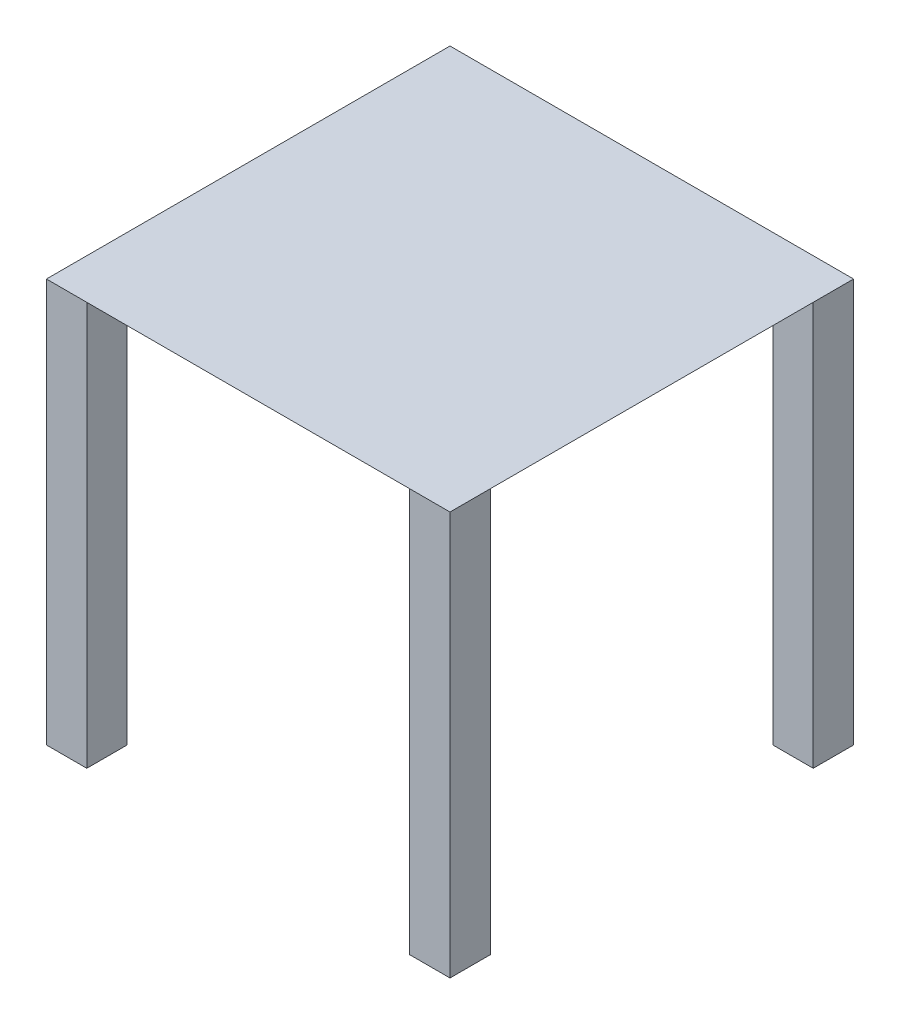
ISO-10303-21;
HEADER;
FILE_DESCRIPTION(('STEP AP214'),'2;1');
FILE_NAME('part.step','',(''),(''),'','','');
FILE_SCHEMA(('AUTOMOTIVE_DESIGN { 1 0 10303 214 1 1 1 1 }'));
ENDSEC;
DATA;
#1=APPLICATION_CONTEXT('core data for automotive mechanical design processes');
#2=APPLICATION_PROTOCOL_DEFINITION('international standard','automotive_design',2000,#1);
#3=PRODUCT_CONTEXT('',#1,'mechanical');
#4=PRODUCT('Part','Part','',(#3));
#5=PRODUCT_RELATED_PRODUCT_CATEGORY('part','',(#4));
#6=PRODUCT_DEFINITION_FORMATION('','',#4);
#7=PRODUCT_DEFINITION_CONTEXT('part definition',#1,'design');
#8=PRODUCT_DEFINITION('design','',#6,#7);
#9=PRODUCT_DEFINITION_SHAPE('','',#8);
#10=(LENGTH_UNIT() NAMED_UNIT(*) SI_UNIT(.MILLI.,.METRE.));
#11=(NAMED_UNIT(*) PLANE_ANGLE_UNIT() SI_UNIT($,.RADIAN.));
#12=(NAMED_UNIT(*) SI_UNIT($,.STERADIAN.) SOLID_ANGLE_UNIT());
#13=UNCERTAINTY_MEASURE_WITH_UNIT(LENGTH_MEASURE(1.E-05),#10,'distance_accuracy_value','');
#14=(GEOMETRIC_REPRESENTATION_CONTEXT(3) GLOBAL_UNCERTAINTY_ASSIGNED_CONTEXT((#13)) GLOBAL_UNIT_ASSIGNED_CONTEXT((#10,
#11,#12)) REPRESENTATION_CONTEXT('',''));
#15=CARTESIAN_POINT('',(0.,0.,0.));
#16=DIRECTION('',(0.,0.,1.));
#17=DIRECTION('',(1.,0.,0.));
#18=AXIS2_PLACEMENT_3D('',#15,#16,#17);
#19=CARTESIAN_POINT('',(0.,0.,0.));
#20=DIRECTION('',(0.,-1.,0.));
#21=DIRECTION('',(0.,0.,-1.));
#22=AXIS2_PLACEMENT_3D('',#19,#20,#21);
#23=PLANE('',#22);
#24=DIRECTION('',(1.,0.,0.));
#25=VECTOR('',#24,1.);
#26=CARTESIAN_POINT('',(-500.,0.,500.));
#27=LINE('',#26,#25);
#28=CARTESIAN_POINT('',(-400.,0.,500.));
#29=VERTEX_POINT('',#28);
#30=CARTESIAN_POINT('',(400.,0.,500.));
#31=VERTEX_POINT('',#30);
#32=EDGE_CURVE('E47',#29,#31,#27,.T.);
#33=ORIENTED_EDGE('',*,*,#32,.T.);
#34=DIRECTION('',(1.,0.,0.));
#35=VECTOR('',#34,1.);
#36=CARTESIAN_POINT('',(500.,0.,500.));
#37=LINE('',#36,#35);
#38=CARTESIAN_POINT('',(500.,0.,500.));
#39=VERTEX_POINT('',#38);
#40=EDGE_CURVE('E204',#31,#39,#37,.T.);
#41=ORIENTED_EDGE('',*,*,#40,.T.);
#42=DIRECTION('',(0.,0.,-1.));
#43=VECTOR('',#42,1.);
#44=CARTESIAN_POINT('',(500.,0.,500.));
#45=LINE('',#44,#43);
#46=CARTESIAN_POINT('',(500.,0.,400.));
#47=VERTEX_POINT('',#46);
#48=EDGE_CURVE('E228',#39,#47,#45,.T.);
#49=ORIENTED_EDGE('',*,*,#48,.T.);
#50=CARTESIAN_POINT('',(500.,0.,-400.));
#51=VERTEX_POINT('',#50);
#52=EDGE_CURVE('E233',#47,#51,#45,.T.);
#53=ORIENTED_EDGE('',*,*,#52,.T.);
#54=DIRECTION('',(0.,0.,-1.));
#55=VECTOR('',#54,1.);
#56=CARTESIAN_POINT('',(500.,0.,-500.));
#57=LINE('',#56,#55);
#58=CARTESIAN_POINT('',(500.,0.,-500.));
#59=VERTEX_POINT('',#58);
#60=EDGE_CURVE('E352',#51,#59,#57,.T.);
#61=ORIENTED_EDGE('',*,*,#60,.T.);
#62=DIRECTION('',(-1.,0.,0.));
#63=VECTOR('',#62,1.);
#64=CARTESIAN_POINT('',(-500.,0.,-500.));
#65=LINE('',#64,#63);
#66=CARTESIAN_POINT('',(400.,0.,-500.));
#67=VERTEX_POINT('',#66);
#68=EDGE_CURVE('E468',#59,#67,#65,.T.);
#69=ORIENTED_EDGE('',*,*,#68,.T.);
#70=CARTESIAN_POINT('',(-400.,0.,-500.));
#71=VERTEX_POINT('',#70);
#72=EDGE_CURVE('E232',#67,#71,#65,.T.);
#73=ORIENTED_EDGE('',*,*,#72,.T.);
#74=DIRECTION('',(-1.,0.,0.));
#75=VECTOR('',#74,1.);
#76=CARTESIAN_POINT('',(-500.,0.,-500.));
#77=LINE('',#76,#75);
#78=CARTESIAN_POINT('',(-500.,0.,-500.));
#79=VERTEX_POINT('',#78);
#80=EDGE_CURVE('E380',#71,#79,#77,.T.);
#81=ORIENTED_EDGE('',*,*,#80,.T.);
#82=DIRECTION('',(0.,0.,1.));
#83=VECTOR('',#82,1.);
#84=CARTESIAN_POINT('',(-500.,0.,500.));
#85=LINE('',#84,#83);
#86=CARTESIAN_POINT('',(-500.,0.,-400.));
#87=VERTEX_POINT('',#86);
#88=EDGE_CURVE('E457',#79,#87,#85,.T.);
#89=ORIENTED_EDGE('',*,*,#88,.T.);
#90=CARTESIAN_POINT('',(-500.,0.,400.));
#91=VERTEX_POINT('',#90);
#92=EDGE_CURVE('E460',#87,#91,#85,.T.);
#93=ORIENTED_EDGE('',*,*,#92,.T.);
#94=DIRECTION('',(0.,0.,1.));
#95=VECTOR('',#94,1.);
#96=CARTESIAN_POINT('',(-500.,0.,500.));
#97=LINE('',#96,#95);
#98=CARTESIAN_POINT('',(-500.,0.,500.));
#99=VERTEX_POINT('',#98);
#100=EDGE_CURVE('E222',#91,#99,#97,.T.);
#101=ORIENTED_EDGE('',*,*,#100,.T.);
#102=EDGE_CURVE('E473',#99,#29,#27,.T.);
#103=ORIENTED_EDGE('',*,*,#102,.T.);
#104=EDGE_LOOP('',(#33,#41,#49,#53,#61,#69,#73,#81,#89,#93,#101,#103));
#105=FACE_BOUND('',#104,.T.);
#106=ADVANCED_FACE('F42',(#105),#23,.F.);
#107=CARTESIAN_POINT('',(-195.121951219512,-243.90243902439,0.));
#108=DIRECTION('',(0.624695047554424,0.78086880944303,0.));
#109=DIRECTION('',(-0.78086880944303,0.624695047554424,0.));
#110=AXIS2_PLACEMENT_3D('',#107,#108,#109);
#111=PLANE('',#110);
#112=DIRECTION('',(0.615457454896664,-0.492365963917331,-0.615457454896664));
#113=VECTOR('',#112,1.);
#114=CARTESIAN_POINT('',(-500.,0.,500.));
#115=LINE('',#114,#113);
#116=CARTESIAN_POINT('',(-400.,-80.,400.));
#117=VERTEX_POINT('',#116);
#118=CARTESIAN_POINT('',(-75.0000000000011,-339.999999999999,75.0000000000015));
#119=VERTEX_POINT('',#118);
#120=EDGE_CURVE('E456',#117,#119,#115,.T.);
#121=ORIENTED_EDGE('',*,*,#120,.F.);
#122=DIRECTION('',(-0.78086880944303,0.624695047554424,0.));
#123=VECTOR('',#122,1.);
#124=CARTESIAN_POINT('',(-195.121951219512,-243.90243902439,400.));
#125=LINE('',#124,#123);
#126=EDGE_CURVE('E348',#117,#91,#125,.T.);
#127=ORIENTED_EDGE('',*,*,#126,.T.);
#128=ORIENTED_EDGE('',*,*,#92,.F.);
#129=DIRECTION('',(0.78086880944303,-0.624695047554424,0.));
#130=VECTOR('',#129,1.);
#131=CARTESIAN_POINT('',(-195.121951219512,-243.90243902439,-400.));
#132=LINE('',#131,#130);
#133=CARTESIAN_POINT('',(-400.,-80.,-400.));
#134=VERTEX_POINT('',#133);
#135=EDGE_CURVE('E398',#87,#134,#132,.T.);
#136=ORIENTED_EDGE('',*,*,#135,.T.);
#137=DIRECTION('',(0.615457454896664,-0.492365963917331,0.615457454896664));
#138=VECTOR('',#137,1.);
#139=CARTESIAN_POINT('',(-500.,0.,-500.));
#140=LINE('',#139,#138);
#141=CARTESIAN_POINT('',(-75.0000000000011,-340.000000000001,-74.9999999999985));
#142=VERTEX_POINT('',#141);
#143=EDGE_CURVE('E474',#134,#142,#140,.T.);
#144=ORIENTED_EDGE('',*,*,#143,.T.);
#145=DIRECTION('',(0.,0.,1.));
#146=VECTOR('',#145,1.);
#147=CARTESIAN_POINT('',(-75.0000000000011,-339.999999999999,0.));
#148=LINE('',#147,#146);
#149=EDGE_CURVE('E318',#142,#119,#148,.T.);
#150=ORIENTED_EDGE('',*,*,#149,.T.);
#151=EDGE_LOOP('',(#121,#127,#128,#136,#144,#150));
#152=FACE_BOUND('',#151,.T.);
#153=ADVANCED_FACE('F257',(#152),#111,.F.);
#154=CARTESIAN_POINT('',(0.,-243.90243902439,195.121951219512));
#155=DIRECTION('',(0.,0.78086880944303,-0.624695047554424));
#156=DIRECTION('',(0.,0.624695047554424,0.78086880944303));
#157=AXIS2_PLACEMENT_3D('',#154,#155,#156);
#158=PLANE('',#157);
#159=DIRECTION('',(-0.615457454896663,-0.492365963917331,-0.615457454896664));
#160=VECTOR('',#159,1.);
#161=CARTESIAN_POINT('',(500.,0.,500.));
#162=LINE('',#161,#160);
#163=CARTESIAN_POINT('',(400.,-80.,400.));
#164=VERTEX_POINT('',#163);
#165=CARTESIAN_POINT('',(74.9999999999989,-340.000000000001,75.0000000000015));
#166=VERTEX_POINT('',#165);
#167=EDGE_CURVE('E455',#164,#166,#162,.T.);
#168=ORIENTED_EDGE('',*,*,#167,.F.);
#169=DIRECTION('',(0.,0.624695047554424,0.78086880944303));
#170=VECTOR('',#169,1.);
#171=CARTESIAN_POINT('',(400.,-243.90243902439,195.121951219512));
#172=LINE('',#171,#170);
#173=EDGE_CURVE('E218',#164,#31,#172,.T.);
#174=ORIENTED_EDGE('',*,*,#173,.T.);
#175=ORIENTED_EDGE('',*,*,#32,.F.);
#176=DIRECTION('',(0.,-0.624695047554424,-0.78086880944303));
#177=VECTOR('',#176,1.);
#178=CARTESIAN_POINT('',(-400.,-243.90243902439,195.121951219512));
#179=LINE('',#178,#177);
#180=EDGE_CURVE('E53',#29,#117,#179,.T.);
#181=ORIENTED_EDGE('',*,*,#180,.T.);
#182=ORIENTED_EDGE('',*,*,#120,.T.);
#183=DIRECTION('',(1.,0.,0.));
#184=VECTOR('',#183,1.);
#185=CARTESIAN_POINT('',(0.,-339.999999999999,75.0000000000015));
#186=LINE('',#185,#184);
#187=EDGE_CURVE('E421',#119,#166,#186,.T.);
#188=ORIENTED_EDGE('',*,*,#187,.T.);
#189=EDGE_LOOP('',(#168,#174,#175,#181,#182,#188));
#190=FACE_BOUND('',#189,.T.);
#191=ADVANCED_FACE('F309',(#190),#158,.F.);
#192=CARTESIAN_POINT('',(0.,-243.90243902439,-195.121951219512));
#193=DIRECTION('',(0.,0.78086880944303,0.624695047554424));
#194=DIRECTION('',(0.,-0.624695047554424,0.78086880944303));
#195=AXIS2_PLACEMENT_3D('',#192,#193,#194);
#196=PLANE('',#195);
#197=ORIENTED_EDGE('',*,*,#72,.F.);
#198=DIRECTION('',(0.,-0.624695047554424,0.78086880944303));
#199=VECTOR('',#198,1.);
#200=CARTESIAN_POINT('',(400.,-243.90243902439,-195.121951219512));
#201=LINE('',#200,#199);
#202=CARTESIAN_POINT('',(400.,-80.,-400.));
#203=VERTEX_POINT('',#202);
#204=EDGE_CURVE('E442',#67,#203,#201,.T.);
#205=ORIENTED_EDGE('',*,*,#204,.T.);
#206=DIRECTION('',(-0.615457454896664,-0.492365963917331,0.615457454896664));
#207=VECTOR('',#206,1.);
#208=CARTESIAN_POINT('',(500.,0.,-500.));
#209=LINE('',#208,#207);
#210=CARTESIAN_POINT('',(74.9999999999984,-340.000000000001,-74.9999999999985));
#211=VERTEX_POINT('',#210);
#212=EDGE_CURVE('E449',#203,#211,#209,.T.);
#213=ORIENTED_EDGE('',*,*,#212,.T.);
#214=DIRECTION('',(-1.,0.,0.));
#215=VECTOR('',#214,1.);
#216=CARTESIAN_POINT('',(0.,-340.000000000001,-74.9999999999985));
#217=LINE('',#216,#215);
#218=EDGE_CURVE('E411',#211,#142,#217,.T.);
#219=ORIENTED_EDGE('',*,*,#218,.T.);
#220=ORIENTED_EDGE('',*,*,#143,.F.);
#221=DIRECTION('',(0.,0.624695047554424,-0.78086880944303));
#222=VECTOR('',#221,1.);
#223=CARTESIAN_POINT('',(-400.,-243.90243902439,-195.121951219512));
#224=LINE('',#223,#222);
#225=EDGE_CURVE('E450',#134,#71,#224,.T.);
#226=ORIENTED_EDGE('',*,*,#225,.T.);
#227=EDGE_LOOP('',(#197,#205,#213,#219,#220,#226));
#228=FACE_BOUND('',#227,.T.);
#229=ADVANCED_FACE('F301',(#228),#196,.F.);
#230=CARTESIAN_POINT('',(195.121951219512,-243.90243902439,0.));
#231=DIRECTION('',(-0.624695047554424,0.78086880944303,0.));
#232=DIRECTION('',(-0.78086880944303,-0.624695047554424,0.));
#233=AXIS2_PLACEMENT_3D('',#230,#231,#232);
#234=PLANE('',#233);
#235=ORIENTED_EDGE('',*,*,#52,.F.);
#236=DIRECTION('',(-0.78086880944303,-0.624695047554424,0.));
#237=VECTOR('',#236,1.);
#238=CARTESIAN_POINT('',(195.121951219512,-243.90243902439,400.));
#239=LINE('',#238,#237);
#240=EDGE_CURVE('E12',#47,#164,#239,.T.);
#241=ORIENTED_EDGE('',*,*,#240,.T.);
#242=ORIENTED_EDGE('',*,*,#167,.T.);
#243=DIRECTION('',(0.,0.,-1.));
#244=VECTOR('',#243,1.);
#245=CARTESIAN_POINT('',(74.9999999999989,-340.000000000001,0.));
#246=LINE('',#245,#244);
#247=EDGE_CURVE('E451',#166,#211,#246,.T.);
#248=ORIENTED_EDGE('',*,*,#247,.T.);
#249=ORIENTED_EDGE('',*,*,#212,.F.);
#250=DIRECTION('',(0.78086880944303,0.624695047554424,0.));
#251=VECTOR('',#250,1.);
#252=CARTESIAN_POINT('',(195.121951219512,-243.90243902439,-400.));
#253=LINE('',#252,#251);
#254=EDGE_CURVE('E336',#203,#51,#253,.T.);
#255=ORIENTED_EDGE('',*,*,#254,.T.);
#256=EDGE_LOOP('',(#235,#241,#242,#248,#249,#255));
#257=FACE_BOUND('',#256,.T.);
#258=ADVANCED_FACE('F44',(#257),#234,.F.);
#259=CARTESIAN_POINT('',(-75.0000000000008,-299.999999999999,75.0000000000015));
#260=DIRECTION('',(-1.,0.,0.));
#261=DIRECTION('',(0.,-1.,0.));
#262=AXIS2_PLACEMENT_3D('',#259,#260,#261);
#263=PLANE('',#262);
#264=DIRECTION('',(0.,-1.,0.));
#265=VECTOR('',#264,1.);
#266=CARTESIAN_POINT('',(-75.0000000000008,-299.999999999999,-74.9999999999985));
#267=LINE('',#266,#265);
#268=CARTESIAN_POINT('',(-75.0000000000008,-299.999999999999,-74.9999999999985));
#269=VERTEX_POINT('',#268);
#270=EDGE_CURVE('E407',#269,#142,#267,.T.);
#271=ORIENTED_EDGE('',*,*,#270,.F.);
#272=DIRECTION('',(0.,0.,-1.));
#273=VECTOR('',#272,1.);
#274=CARTESIAN_POINT('',(-75.0000000000008,-299.999999999999,75.0000000000015));
#275=LINE('',#274,#273);
#276=CARTESIAN_POINT('',(-75.0000000000008,-299.999999999999,75.0000000000015));
#277=VERTEX_POINT('',#276);
#278=EDGE_CURVE('E394',#277,#269,#275,.T.);
#279=ORIENTED_EDGE('',*,*,#278,.F.);
#280=DIRECTION('',(0.,-1.,0.));
#281=VECTOR('',#280,1.);
#282=CARTESIAN_POINT('',(-75.0000000000008,-299.999999999999,75.0000000000015));
#283=LINE('',#282,#281);
#284=EDGE_CURVE('E408',#277,#119,#283,.T.);
#285=ORIENTED_EDGE('',*,*,#284,.T.);
#286=ORIENTED_EDGE('',*,*,#149,.F.);
#287=EDGE_LOOP('',(#271,#279,#285,#286));
#288=FACE_BOUND('',#287,.T.);
#289=ADVANCED_FACE('F259',(#288),#263,.F.);
#290=CARTESIAN_POINT('',(74.9999999999992,-300.000000000001,75.0000000000015));
#291=DIRECTION('',(0.,0.,1.));
#292=DIRECTION('',(1.,0.,0.));
#293=AXIS2_PLACEMENT_3D('',#290,#291,#292);
#294=PLANE('',#293);
#295=ORIENTED_EDGE('',*,*,#284,.F.);
#296=DIRECTION('',(-1.,0.,0.));
#297=VECTOR('',#296,1.);
#298=CARTESIAN_POINT('',(74.9999999999992,-300.000000000001,75.0000000000015));
#299=LINE('',#298,#297);
#300=CARTESIAN_POINT('',(74.9999999999992,-300.000000000001,75.0000000000015));
#301=VERTEX_POINT('',#300);
#302=EDGE_CURVE('E404',#301,#277,#299,.T.);
#303=ORIENTED_EDGE('',*,*,#302,.F.);
#304=DIRECTION('',(0.,-1.,0.));
#305=VECTOR('',#304,1.);
#306=CARTESIAN_POINT('',(74.9999999999992,-300.000000000001,75.0000000000015));
#307=LINE('',#306,#305);
#308=EDGE_CURVE('E412',#301,#166,#307,.T.);
#309=ORIENTED_EDGE('',*,*,#308,.T.);
#310=ORIENTED_EDGE('',*,*,#187,.F.);
#311=EDGE_LOOP('',(#295,#303,#309,#310));
#312=FACE_BOUND('',#311,.T.);
#313=ADVANCED_FACE('F490',(#312),#294,.F.);
#314=CARTESIAN_POINT('',(74.9999999999992,-300.000000000001,75.0000000000015));
#315=DIRECTION('',(1.,0.,0.));
#316=DIRECTION('',(0.,1.,0.));
#317=AXIS2_PLACEMENT_3D('',#314,#315,#316);
#318=PLANE('',#317);
#319=ORIENTED_EDGE('',*,*,#308,.F.);
#320=DIRECTION('',(0.,0.,1.));
#321=VECTOR('',#320,1.);
#322=CARTESIAN_POINT('',(74.9999999999992,-300.000000000001,75.0000000000015));
#323=LINE('',#322,#321);
#324=CARTESIAN_POINT('',(74.9999999999992,-300.000000000001,-74.9999999999985));
#325=VERTEX_POINT('',#324);
#326=EDGE_CURVE('E401',#325,#301,#323,.T.);
#327=ORIENTED_EDGE('',*,*,#326,.F.);
#328=DIRECTION('',(0.,-1.,0.));
#329=VECTOR('',#328,1.);
#330=CARTESIAN_POINT('',(74.9999999999992,-300.000000000001,-74.9999999999985));
#331=LINE('',#330,#329);
#332=EDGE_CURVE('E415',#325,#211,#331,.T.);
#333=ORIENTED_EDGE('',*,*,#332,.T.);
#334=ORIENTED_EDGE('',*,*,#247,.F.);
#335=EDGE_LOOP('',(#319,#327,#333,#334));
#336=FACE_BOUND('',#335,.T.);
#337=ADVANCED_FACE('F485',(#336),#318,.F.);
#338=CARTESIAN_POINT('',(74.9999999999992,-300.000000000001,-74.9999999999985));
#339=DIRECTION('',(0.,0.,-1.));
#340=DIRECTION('',(-1.,0.,0.));
#341=AXIS2_PLACEMENT_3D('',#338,#339,#340);
#342=PLANE('',#341);
#343=ORIENTED_EDGE('',*,*,#332,.F.);
#344=DIRECTION('',(1.,0.,0.));
#345=VECTOR('',#344,1.);
#346=CARTESIAN_POINT('',(74.9999999999992,-300.000000000001,-74.9999999999985));
#347=LINE('',#346,#345);
#348=EDGE_CURVE('E397',#269,#325,#347,.T.);
#349=ORIENTED_EDGE('',*,*,#348,.F.);
#350=ORIENTED_EDGE('',*,*,#270,.T.);
#351=ORIENTED_EDGE('',*,*,#218,.F.);
#352=EDGE_LOOP('',(#343,#349,#350,#351));
#353=FACE_BOUND('',#352,.T.);
#354=ADVANCED_FACE('F496',(#353),#342,.F.);
#355=CARTESIAN_POINT('',(-1.96623899133175E-12,-300.,0.));
#356=DIRECTION('',(0.,1.,0.));
#357=DIRECTION('',(-1.,0.,0.));
#358=AXIS2_PLACEMENT_3D('',#355,#356,#357);
#359=PLANE('',#358);
#360=ORIENTED_EDGE('',*,*,#278,.T.);
#361=ORIENTED_EDGE('',*,*,#348,.T.);
#362=ORIENTED_EDGE('',*,*,#326,.T.);
#363=ORIENTED_EDGE('',*,*,#302,.T.);
#364=EDGE_LOOP('',(#360,#361,#362,#363));
#365=FACE_BOUND('',#364,.T.);
#366=ADVANCED_FACE('F493',(#365),#359,.F.);
#367=CARTESIAN_POINT('',(-400.,-1000.,-500.));
#368=DIRECTION('',(1.,0.,0.));
#369=DIRECTION('',(0.,0.,-1.));
#370=AXIS2_PLACEMENT_3D('',#367,#368,#369);
#371=PLANE('',#370);
#372=ORIENTED_EDGE('',*,*,#225,.F.);
#373=DIRECTION('',(0.,1.,0.));
#374=VECTOR('',#373,1.);
#375=CARTESIAN_POINT('',(-400.,-1000.,-400.));
#376=LINE('',#375,#374);
#377=CARTESIAN_POINT('',(-400.,-1000.,-400.));
#378=VERTEX_POINT('',#377);
#379=EDGE_CURVE('E390',#378,#134,#376,.T.);
#380=ORIENTED_EDGE('',*,*,#379,.F.);
#381=DIRECTION('',(0.,0.,-1.));
#382=VECTOR('',#381,1.);
#383=CARTESIAN_POINT('',(-400.,-1000.,-500.));
#384=LINE('',#383,#382);
#385=CARTESIAN_POINT('',(-400.,-1000.,-500.));
#386=VERTEX_POINT('',#385);
#387=EDGE_CURVE('E383',#378,#386,#384,.T.);
#388=ORIENTED_EDGE('',*,*,#387,.T.);
#389=DIRECTION('',(0.,1.,0.));
#390=VECTOR('',#389,1.);
#391=CARTESIAN_POINT('',(-400.,-1000.,-500.));
#392=LINE('',#391,#390);
#393=EDGE_CURVE('E393',#386,#71,#392,.T.);
#394=ORIENTED_EDGE('',*,*,#393,.T.);
#395=EDGE_LOOP('',(#372,#380,#388,#394));
#396=FACE_BOUND('',#395,.T.);
#397=ADVANCED_FACE('F565',(#396),#371,.T.);
#398=CARTESIAN_POINT('',(-500.,-1000.,-400.));
#399=DIRECTION('',(0.,0.,1.));
#400=DIRECTION('',(1.,0.,0.));
#401=AXIS2_PLACEMENT_3D('',#398,#399,#400);
#402=PLANE('',#401);
#403=ORIENTED_EDGE('',*,*,#135,.F.);
#404=DIRECTION('',(0.,1.,0.));
#405=VECTOR('',#404,1.);
#406=CARTESIAN_POINT('',(-500.,-1000.,-400.));
#407=LINE('',#406,#405);
#408=CARTESIAN_POINT('',(-500.,-1000.,-400.));
#409=VERTEX_POINT('',#408);
#410=EDGE_CURVE('E389',#409,#87,#407,.T.);
#411=ORIENTED_EDGE('',*,*,#410,.F.);
#412=DIRECTION('',(1.,0.,0.));
#413=VECTOR('',#412,1.);
#414=CARTESIAN_POINT('',(-500.,-1000.,-400.));
#415=LINE('',#414,#413);
#416=EDGE_CURVE('E379',#409,#378,#415,.T.);
#417=ORIENTED_EDGE('',*,*,#416,.T.);
#418=ORIENTED_EDGE('',*,*,#379,.T.);
#419=EDGE_LOOP('',(#403,#411,#417,#418));
#420=FACE_BOUND('',#419,.T.);
#421=ADVANCED_FACE('F559',(#420),#402,.T.);
#422=CARTESIAN_POINT('',(-500.,-1000.,-500.));
#423=DIRECTION('',(-1.,0.,0.));
#424=DIRECTION('',(0.,0.,1.));
#425=AXIS2_PLACEMENT_3D('',#422,#423,#424);
#426=PLANE('',#425);
#427=ORIENTED_EDGE('',*,*,#88,.F.);
#428=DIRECTION('',(0.,1.,0.));
#429=VECTOR('',#428,1.);
#430=CARTESIAN_POINT('',(-500.,-1000.,-500.));
#431=LINE('',#430,#429);
#432=CARTESIAN_POINT('',(-500.,-1000.,-500.));
#433=VERTEX_POINT('',#432);
#434=EDGE_CURVE('E521',#433,#79,#431,.T.);
#435=ORIENTED_EDGE('',*,*,#434,.F.);
#436=DIRECTION('',(0.,0.,1.));
#437=VECTOR('',#436,1.);
#438=CARTESIAN_POINT('',(-500.,-1000.,-500.));
#439=LINE('',#438,#437);
#440=EDGE_CURVE('E376',#433,#409,#439,.T.);
#441=ORIENTED_EDGE('',*,*,#440,.T.);
#442=ORIENTED_EDGE('',*,*,#410,.T.);
#443=EDGE_LOOP('',(#427,#435,#441,#442));
#444=FACE_BOUND('',#443,.T.);
#445=ADVANCED_FACE('F555',(#444),#426,.T.);
#446=CARTESIAN_POINT('',(-500.,-1000.,-500.));
#447=DIRECTION('',(0.,0.,-1.));
#448=DIRECTION('',(-1.,0.,0.));
#449=AXIS2_PLACEMENT_3D('',#446,#447,#448);
#450=PLANE('',#449);
#451=ORIENTED_EDGE('',*,*,#80,.F.);
#452=ORIENTED_EDGE('',*,*,#393,.F.);
#453=DIRECTION('',(-1.,0.,0.));
#454=VECTOR('',#453,1.);
#455=CARTESIAN_POINT('',(-500.,-1000.,-500.));
#456=LINE('',#455,#454);
#457=EDGE_CURVE('E386',#386,#433,#456,.T.);
#458=ORIENTED_EDGE('',*,*,#457,.T.);
#459=ORIENTED_EDGE('',*,*,#434,.T.);
#460=EDGE_LOOP('',(#451,#452,#458,#459));
#461=FACE_BOUND('',#460,.T.);
#462=ADVANCED_FACE('F644',(#461),#450,.T.);
#463=CARTESIAN_POINT('',(0.,-1000.,0.));
#464=DIRECTION('',(0.,1.,0.));
#465=DIRECTION('',(0.,0.,1.));
#466=AXIS2_PLACEMENT_3D('',#463,#464,#465);
#467=PLANE('',#466);
#468=ORIENTED_EDGE('',*,*,#440,.F.);
#469=ORIENTED_EDGE('',*,*,#457,.F.);
#470=ORIENTED_EDGE('',*,*,#387,.F.);
#471=ORIENTED_EDGE('',*,*,#416,.F.);
#472=EDGE_LOOP('',(#468,#469,#470,#471));
#473=FACE_BOUND('',#472,.T.);
#474=ADVANCED_FACE('F562',(#473),#467,.F.);
#475=CARTESIAN_POINT('',(500.,-1000.,-400.));
#476=DIRECTION('',(0.,0.,1.));
#477=DIRECTION('',(1.,0.,0.));
#478=AXIS2_PLACEMENT_3D('',#475,#476,#477);
#479=PLANE('',#478);
#480=ORIENTED_EDGE('',*,*,#254,.F.);
#481=DIRECTION('',(0.,1.,0.));
#482=VECTOR('',#481,1.);
#483=CARTESIAN_POINT('',(400.,-1000.,-400.));
#484=LINE('',#483,#482);
#485=CARTESIAN_POINT('',(400.,-1000.,-400.));
#486=VERTEX_POINT('',#485);
#487=EDGE_CURVE('E371',#486,#203,#484,.T.);
#488=ORIENTED_EDGE('',*,*,#487,.F.);
#489=DIRECTION('',(1.,0.,0.));
#490=VECTOR('',#489,1.);
#491=CARTESIAN_POINT('',(500.,-1000.,-400.));
#492=LINE('',#491,#490);
#493=CARTESIAN_POINT('',(500.,-1000.,-400.));
#494=VERTEX_POINT('',#493);
#495=EDGE_CURVE('E368',#486,#494,#492,.T.);
#496=ORIENTED_EDGE('',*,*,#495,.T.);
#497=DIRECTION('',(0.,1.,0.));
#498=VECTOR('',#497,1.);
#499=CARTESIAN_POINT('',(500.,-1000.,-400.));
#500=LINE('',#499,#498);
#501=EDGE_CURVE('E374',#494,#51,#500,.T.);
#502=ORIENTED_EDGE('',*,*,#501,.T.);
#503=EDGE_LOOP('',(#480,#488,#496,#502));
#504=FACE_BOUND('',#503,.T.);
#505=ADVANCED_FACE('F438',(#504),#479,.T.);
#506=CARTESIAN_POINT('',(400.,-1000.,-500.));
#507=DIRECTION('',(-1.,0.,0.));
#508=DIRECTION('',(0.,0.,1.));
#509=AXIS2_PLACEMENT_3D('',#506,#507,#508);
#510=PLANE('',#509);
#511=ORIENTED_EDGE('',*,*,#204,.F.);
#512=DIRECTION('',(0.,1.,0.));
#513=VECTOR('',#512,1.);
#514=CARTESIAN_POINT('',(400.,-1000.,-500.));
#515=LINE('',#514,#513);
#516=CARTESIAN_POINT('',(400.,-1000.,-500.));
#517=VERTEX_POINT('',#516);
#518=EDGE_CURVE('E375',#517,#67,#515,.T.);
#519=ORIENTED_EDGE('',*,*,#518,.F.);
#520=DIRECTION('',(0.,0.,1.));
#521=VECTOR('',#520,1.);
#522=CARTESIAN_POINT('',(400.,-1000.,-500.));
#523=LINE('',#522,#521);
#524=EDGE_CURVE('E365',#517,#486,#523,.T.);
#525=ORIENTED_EDGE('',*,*,#524,.T.);
#526=ORIENTED_EDGE('',*,*,#487,.T.);
#527=EDGE_LOOP('',(#511,#519,#525,#526));
#528=FACE_BOUND('',#527,.T.);
#529=ADVANCED_FACE('F656',(#528),#510,.T.);
#530=CARTESIAN_POINT('',(500.,-1000.,-500.));
#531=DIRECTION('',(1.,0.,0.));
#532=DIRECTION('',(0.,0.,-1.));
#533=AXIS2_PLACEMENT_3D('',#530,#531,#532);
#534=PLANE('',#533);
#535=ORIENTED_EDGE('',*,*,#60,.F.);
#536=ORIENTED_EDGE('',*,*,#501,.F.);
#537=DIRECTION('',(0.,0.,-1.));
#538=VECTOR('',#537,1.);
#539=CARTESIAN_POINT('',(500.,-1000.,-500.));
#540=LINE('',#539,#538);
#541=CARTESIAN_POINT('',(500.,-1000.,-500.));
#542=VERTEX_POINT('',#541);
#543=EDGE_CURVE('E359',#494,#542,#540,.T.);
#544=ORIENTED_EDGE('',*,*,#543,.T.);
#545=DIRECTION('',(0.,1.,0.));
#546=VECTOR('',#545,1.);
#547=CARTESIAN_POINT('',(500.,-1000.,-500.));
#548=LINE('',#547,#546);
#549=EDGE_CURVE('E291',#542,#59,#548,.T.);
#550=ORIENTED_EDGE('',*,*,#549,.T.);
#551=EDGE_LOOP('',(#535,#536,#544,#550));
#552=FACE_BOUND('',#551,.T.);
#553=ADVANCED_FACE('F445',(#552),#534,.T.);
#554=CARTESIAN_POINT('',(500.,-1000.,-500.));
#555=DIRECTION('',(0.,0.,-1.));
#556=DIRECTION('',(-1.,0.,0.));
#557=AXIS2_PLACEMENT_3D('',#554,#555,#556);
#558=PLANE('',#557);
#559=ORIENTED_EDGE('',*,*,#68,.F.);
#560=ORIENTED_EDGE('',*,*,#549,.F.);
#561=DIRECTION('',(-1.,0.,0.));
#562=VECTOR('',#561,1.);
#563=CARTESIAN_POINT('',(500.,-1000.,-500.));
#564=LINE('',#563,#562);
#565=EDGE_CURVE('E362',#542,#517,#564,.T.);
#566=ORIENTED_EDGE('',*,*,#565,.T.);
#567=ORIENTED_EDGE('',*,*,#518,.T.);
#568=EDGE_LOOP('',(#559,#560,#566,#567));
#569=FACE_BOUND('',#568,.T.);
#570=ADVANCED_FACE('F655',(#569),#558,.T.);
#571=CARTESIAN_POINT('',(0.,-1000.,0.));
#572=DIRECTION('',(0.,-1.,0.));
#573=DIRECTION('',(0.,0.,-1.));
#574=AXIS2_PLACEMENT_3D('',#571,#572,#573);
#575=PLANE('',#574);
#576=ORIENTED_EDGE('',*,*,#543,.F.);
#577=ORIENTED_EDGE('',*,*,#495,.F.);
#578=ORIENTED_EDGE('',*,*,#524,.F.);
#579=ORIENTED_EDGE('',*,*,#565,.F.);
#580=EDGE_LOOP('',(#576,#577,#578,#579));
#581=FACE_BOUND('',#580,.T.);
#582=ADVANCED_FACE('F659',(#581),#575,.T.);
#583=CARTESIAN_POINT('',(-500.,-1000.,400.));
#584=DIRECTION('',(0.,0.,-1.));
#585=DIRECTION('',(-1.,0.,0.));
#586=AXIS2_PLACEMENT_3D('',#583,#584,#585);
#587=PLANE('',#586);
#588=ORIENTED_EDGE('',*,*,#126,.F.);
#589=DIRECTION('',(0.,1.,0.));
#590=VECTOR('',#589,1.);
#591=CARTESIAN_POINT('',(-400.,-1000.,400.));
#592=LINE('',#591,#590);
#593=CARTESIAN_POINT('',(-400.,-1000.,400.));
#594=VERTEX_POINT('',#593);
#595=EDGE_CURVE('E340',#594,#117,#592,.T.);
#596=ORIENTED_EDGE('',*,*,#595,.F.);
#597=DIRECTION('',(-1.,0.,0.));
#598=VECTOR('',#597,1.);
#599=CARTESIAN_POINT('',(-500.,-1000.,400.));
#600=LINE('',#599,#598);
#601=CARTESIAN_POINT('',(-500.,-1000.,400.));
#602=VERTEX_POINT('',#601);
#603=EDGE_CURVE('E345',#594,#602,#600,.T.);
#604=ORIENTED_EDGE('',*,*,#603,.T.);
#605=DIRECTION('',(0.,1.,0.));
#606=VECTOR('',#605,1.);
#607=CARTESIAN_POINT('',(-500.,-1000.,400.));
#608=LINE('',#607,#606);
#609=EDGE_CURVE('E353',#602,#91,#608,.T.);
#610=ORIENTED_EDGE('',*,*,#609,.T.);
#611=EDGE_LOOP('',(#588,#596,#604,#610));
#612=FACE_BOUND('',#611,.T.);
#613=ADVANCED_FACE('F667',(#612),#587,.T.);
#614=CARTESIAN_POINT('',(-400.,-1000.,500.));
#615=DIRECTION('',(1.,0.,0.));
#616=DIRECTION('',(0.,0.,-1.));
#617=AXIS2_PLACEMENT_3D('',#614,#615,#616);
#618=PLANE('',#617);
#619=ORIENTED_EDGE('',*,*,#180,.F.);
#620=DIRECTION('',(0.,1.,0.));
#621=VECTOR('',#620,1.);
#622=CARTESIAN_POINT('',(-400.,-1000.,500.));
#623=LINE('',#622,#621);
#624=CARTESIAN_POINT('',(-400.,-1000.,500.));
#625=VERTEX_POINT('',#624);
#626=EDGE_CURVE('E69',#625,#29,#623,.T.);
#627=ORIENTED_EDGE('',*,*,#626,.F.);
#628=DIRECTION('',(0.,0.,-1.));
#629=VECTOR('',#628,1.);
#630=CARTESIAN_POINT('',(-400.,-1000.,500.));
#631=LINE('',#630,#629);
#632=EDGE_CURVE('E821',#625,#594,#631,.T.);
#633=ORIENTED_EDGE('',*,*,#632,.T.);
#634=ORIENTED_EDGE('',*,*,#595,.T.);
#635=EDGE_LOOP('',(#619,#627,#633,#634));
#636=FACE_BOUND('',#635,.T.);
#637=ADVANCED_FACE('F673',(#636),#618,.T.);
#638=CARTESIAN_POINT('',(-500.,-1000.,500.));
#639=DIRECTION('',(-1.,0.,0.));
#640=DIRECTION('',(0.,0.,1.));
#641=AXIS2_PLACEMENT_3D('',#638,#639,#640);
#642=PLANE('',#641);
#643=ORIENTED_EDGE('',*,*,#100,.F.);
#644=ORIENTED_EDGE('',*,*,#609,.F.);
#645=DIRECTION('',(0.,0.,1.));
#646=VECTOR('',#645,1.);
#647=CARTESIAN_POINT('',(-500.,-1000.,500.));
#648=LINE('',#647,#646);
#649=CARTESIAN_POINT('',(-500.,-1000.,500.));
#650=VERTEX_POINT('',#649);
#651=EDGE_CURVE('E215',#602,#650,#648,.T.);
#652=ORIENTED_EDGE('',*,*,#651,.T.);
#653=DIRECTION('',(0.,1.,0.));
#654=VECTOR('',#653,1.);
#655=CARTESIAN_POINT('',(-500.,-1000.,500.));
#656=LINE('',#655,#654);
#657=EDGE_CURVE('E341',#650,#99,#656,.T.);
#658=ORIENTED_EDGE('',*,*,#657,.T.);
#659=EDGE_LOOP('',(#643,#644,#652,#658));
#660=FACE_BOUND('',#659,.T.);
#661=ADVANCED_FACE('F669',(#660),#642,.T.);
#662=CARTESIAN_POINT('',(-500.,-1000.,500.));
#663=DIRECTION('',(0.,0.,1.));
#664=DIRECTION('',(1.,0.,0.));
#665=AXIS2_PLACEMENT_3D('',#662,#663,#664);
#666=PLANE('',#665);
#667=ORIENTED_EDGE('',*,*,#102,.F.);
#668=ORIENTED_EDGE('',*,*,#657,.F.);
#669=DIRECTION('',(1.,0.,0.));
#670=VECTOR('',#669,1.);
#671=CARTESIAN_POINT('',(-500.,-1000.,500.));
#672=LINE('',#671,#670);
#673=EDGE_CURVE('E819',#650,#625,#672,.T.);
#674=ORIENTED_EDGE('',*,*,#673,.T.);
#675=ORIENTED_EDGE('',*,*,#626,.T.);
#676=EDGE_LOOP('',(#667,#668,#674,#675));
#677=FACE_BOUND('',#676,.T.);
#678=ADVANCED_FACE('F672',(#677),#666,.T.);
#679=CARTESIAN_POINT('',(0.,-1000.,0.));
#680=DIRECTION('',(0.,-1.,0.));
#681=DIRECTION('',(0.,0.,-1.));
#682=AXIS2_PLACEMENT_3D('',#679,#680,#681);
#683=PLANE('',#682);
#684=ORIENTED_EDGE('',*,*,#651,.F.);
#685=ORIENTED_EDGE('',*,*,#603,.F.);
#686=ORIENTED_EDGE('',*,*,#632,.F.);
#687=ORIENTED_EDGE('',*,*,#673,.F.);
#688=EDGE_LOOP('',(#684,#685,#686,#687));
#689=FACE_BOUND('',#688,.T.);
#690=ADVANCED_FACE('F677',(#689),#683,.T.);
#691=CARTESIAN_POINT('',(400.,-1000.,500.));
#692=DIRECTION('',(-1.,0.,0.));
#693=DIRECTION('',(0.,0.,1.));
#694=AXIS2_PLACEMENT_3D('',#691,#692,#693);
#695=PLANE('',#694);
#696=ORIENTED_EDGE('',*,*,#173,.F.);
#697=DIRECTION('',(0.,1.,0.));
#698=VECTOR('',#697,1.);
#699=CARTESIAN_POINT('',(400.,-1000.,400.));
#700=LINE('',#699,#698);
#701=CARTESIAN_POINT('',(400.,-1000.,400.));
#702=VERTEX_POINT('',#701);
#703=EDGE_CURVE('E189',#702,#164,#700,.T.);
#704=ORIENTED_EDGE('',*,*,#703,.F.);
#705=DIRECTION('',(0.,0.,1.));
#706=VECTOR('',#705,1.);
#707=CARTESIAN_POINT('',(400.,-1000.,500.));
#708=LINE('',#707,#706);
#709=CARTESIAN_POINT('',(400.,-1000.,500.));
#710=VERTEX_POINT('',#709);
#711=EDGE_CURVE('E200',#702,#710,#708,.T.);
#712=ORIENTED_EDGE('',*,*,#711,.T.);
#713=DIRECTION('',(0.,1.,0.));
#714=VECTOR('',#713,1.);
#715=CARTESIAN_POINT('',(400.,-1000.,500.));
#716=LINE('',#715,#714);
#717=EDGE_CURVE('E212',#710,#31,#716,.T.);
#718=ORIENTED_EDGE('',*,*,#717,.T.);
#719=EDGE_LOOP('',(#696,#704,#712,#718));
#720=FACE_BOUND('',#719,.T.);
#721=ADVANCED_FACE('F481',(#720),#695,.T.);
#722=CARTESIAN_POINT('',(500.,-1000.,400.));
#723=DIRECTION('',(0.,0.,-1.));
#724=DIRECTION('',(-1.,0.,0.));
#725=AXIS2_PLACEMENT_3D('',#722,#723,#724);
#726=PLANE('',#725);
#727=ORIENTED_EDGE('',*,*,#240,.F.);
#728=DIRECTION('',(0.,1.,0.));
#729=VECTOR('',#728,1.);
#730=CARTESIAN_POINT('',(500.,-1000.,400.));
#731=LINE('',#730,#729);
#732=CARTESIAN_POINT('',(500.,-1000.,400.));
#733=VERTEX_POINT('',#732);
#734=EDGE_CURVE('E61',#733,#47,#731,.T.);
#735=ORIENTED_EDGE('',*,*,#734,.F.);
#736=DIRECTION('',(-1.,0.,0.));
#737=VECTOR('',#736,1.);
#738=CARTESIAN_POINT('',(500.,-1000.,400.));
#739=LINE('',#738,#737);
#740=EDGE_CURVE('E187',#733,#702,#739,.T.);
#741=ORIENTED_EDGE('',*,*,#740,.T.);
#742=ORIENTED_EDGE('',*,*,#703,.T.);
#743=EDGE_LOOP('',(#727,#735,#741,#742));
#744=FACE_BOUND('',#743,.T.);
#745=ADVANCED_FACE('F185',(#744),#726,.T.);
#746=CARTESIAN_POINT('',(500.,-1000.,500.));
#747=DIRECTION('',(1.,0.,0.));
#748=DIRECTION('',(0.,0.,-1.));
#749=AXIS2_PLACEMENT_3D('',#746,#747,#748);
#750=PLANE('',#749);
#751=ORIENTED_EDGE('',*,*,#48,.F.);
#752=DIRECTION('',(0.,1.,0.));
#753=VECTOR('',#752,1.);
#754=CARTESIAN_POINT('',(500.,-1000.,500.));
#755=LINE('',#754,#753);
#756=CARTESIAN_POINT('',(500.,-1000.,500.));
#757=VERTEX_POINT('',#756);
#758=EDGE_CURVE('E203',#757,#39,#755,.T.);
#759=ORIENTED_EDGE('',*,*,#758,.F.);
#760=DIRECTION('',(0.,0.,-1.));
#761=VECTOR('',#760,1.);
#762=CARTESIAN_POINT('',(500.,-1000.,500.));
#763=LINE('',#762,#761);
#764=EDGE_CURVE('E197',#757,#733,#763,.T.);
#765=ORIENTED_EDGE('',*,*,#764,.T.);
#766=ORIENTED_EDGE('',*,*,#734,.T.);
#767=EDGE_LOOP('',(#751,#759,#765,#766));
#768=FACE_BOUND('',#767,.T.);
#769=ADVANCED_FACE('F202',(#768),#750,.T.);
#770=CARTESIAN_POINT('',(500.,-1000.,500.));
#771=DIRECTION('',(0.,0.,1.));
#772=DIRECTION('',(1.,0.,0.));
#773=AXIS2_PLACEMENT_3D('',#770,#771,#772);
#774=PLANE('',#773);
#775=ORIENTED_EDGE('',*,*,#40,.F.);
#776=ORIENTED_EDGE('',*,*,#717,.F.);
#777=DIRECTION('',(1.,0.,0.));
#778=VECTOR('',#777,1.);
#779=CARTESIAN_POINT('',(500.,-1000.,500.));
#780=LINE('',#779,#778);
#781=EDGE_CURVE('E190',#710,#757,#780,.T.);
#782=ORIENTED_EDGE('',*,*,#781,.T.);
#783=ORIENTED_EDGE('',*,*,#758,.T.);
#784=EDGE_LOOP('',(#775,#776,#782,#783));
#785=FACE_BOUND('',#784,.T.);
#786=ADVANCED_FACE('F479',(#785),#774,.T.);
#787=CARTESIAN_POINT('',(0.,-1000.,0.));
#788=DIRECTION('',(0.,1.,0.));
#789=DIRECTION('',(0.,0.,1.));
#790=AXIS2_PLACEMENT_3D('',#787,#788,#789);
#791=PLANE('',#790);
#792=ORIENTED_EDGE('',*,*,#764,.F.);
#793=ORIENTED_EDGE('',*,*,#781,.F.);
#794=ORIENTED_EDGE('',*,*,#711,.F.);
#795=ORIENTED_EDGE('',*,*,#740,.F.);
#796=EDGE_LOOP('',(#792,#793,#794,#795));
#797=FACE_BOUND('',#796,.T.);
#798=ADVANCED_FACE('F195',(#797),#791,.F.);
#799=CLOSED_SHELL('',(#106,#153,#191,#229,#258,#289,#313,#337,#354,#366,#397,#421,#445,#462,
#474,#505,#529,#553,#570,#582,#613,#637,#661,#678,#690,#721,#745,#769,#786,#798));
#800=MANIFOLD_SOLID_BREP('B2',#799);
#801=ADVANCED_BREP_SHAPE_REPRESENTATION('',(#18,#800),#14);
#802=SHAPE_DEFINITION_REPRESENTATION(#9,#801);
ENDSEC;
END-ISO-10303-21;
